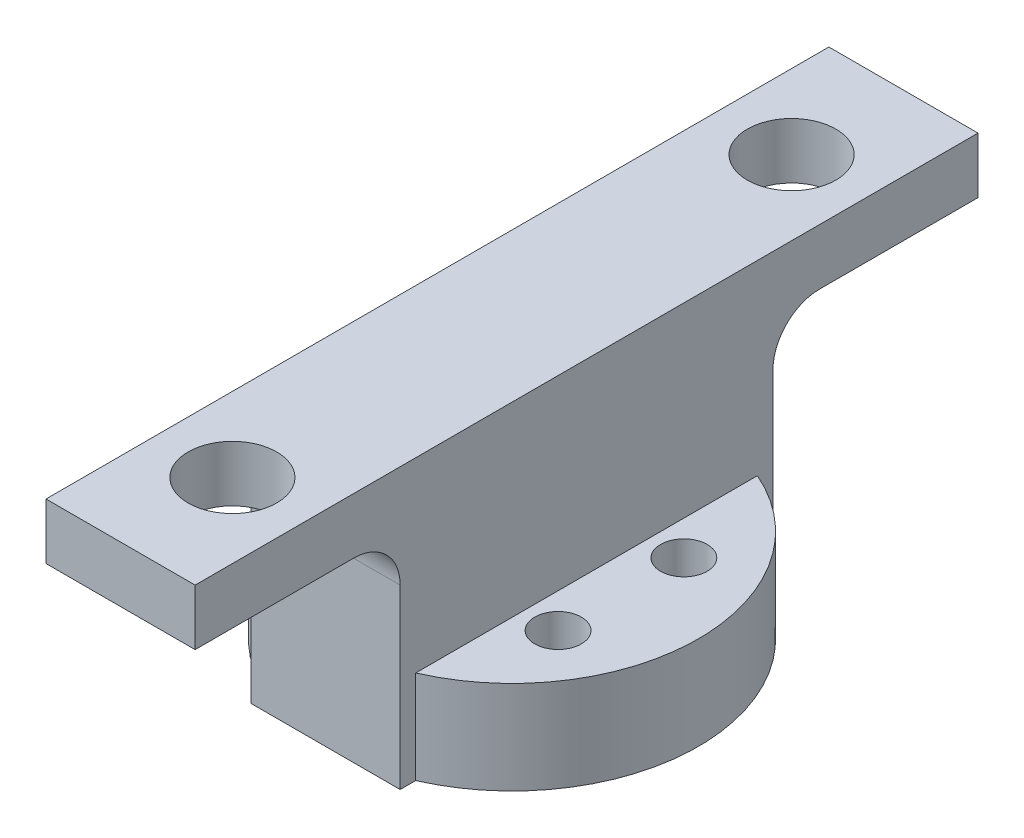
ISO-10303-21;
HEADER;
FILE_DESCRIPTION(('STEP AP214'),'2;1');
FILE_NAME('part.step','',(''),(''),'','','');
FILE_SCHEMA(('AUTOMOTIVE_DESIGN { 1 0 10303 214 1 1 1 1 }'));
ENDSEC;
DATA;
#1=APPLICATION_CONTEXT('core data for automotive mechanical design processes');
#2=APPLICATION_PROTOCOL_DEFINITION('international standard','automotive_design',2000,#1);
#3=PRODUCT_CONTEXT('',#1,'mechanical');
#4=PRODUCT('Part','Part','',(#3));
#5=PRODUCT_RELATED_PRODUCT_CATEGORY('part','',(#4));
#6=PRODUCT_DEFINITION_FORMATION('','',#4);
#7=PRODUCT_DEFINITION_CONTEXT('part definition',#1,'design');
#8=PRODUCT_DEFINITION('design','',#6,#7);
#9=PRODUCT_DEFINITION_SHAPE('','',#8);
#10=(LENGTH_UNIT() NAMED_UNIT(*) SI_UNIT(.MILLI.,.METRE.));
#11=(NAMED_UNIT(*) PLANE_ANGLE_UNIT() SI_UNIT($,.RADIAN.));
#12=(NAMED_UNIT(*) SI_UNIT($,.STERADIAN.) SOLID_ANGLE_UNIT());
#13=UNCERTAINTY_MEASURE_WITH_UNIT(LENGTH_MEASURE(1.E-05),#10,'distance_accuracy_value','');
#14=(GEOMETRIC_REPRESENTATION_CONTEXT(3) GLOBAL_UNCERTAINTY_ASSIGNED_CONTEXT((#13)) GLOBAL_UNIT_ASSIGNED_CONTEXT((#10,
#11,#12)) REPRESENTATION_CONTEXT('',''));
#15=CARTESIAN_POINT('',(0.,0.,0.));
#16=DIRECTION('',(0.,0.,1.));
#17=DIRECTION('',(1.,0.,0.));
#18=AXIS2_PLACEMENT_3D('',#15,#16,#17);
#19=CARTESIAN_POINT('',(0.,10.,0.));
#20=DIRECTION('',(0.,-1.,0.));
#21=DIRECTION('',(0.,0.,-1.));
#22=AXIS2_PLACEMENT_3D('',#19,#20,#21);
#23=CYLINDRICAL_SURFACE('',#22,20.);
#24=DIRECTION('',(0.,1.,0.));
#25=VECTOR('',#24,1.);
#26=CARTESIAN_POINT('',(-8.,-8.1723857475688,-18.3303027798234));
#27=LINE('',#26,#25);
#28=CARTESIAN_POINT('',(-8.,0.,-18.3303027798234));
#29=VERTEX_POINT('',#28);
#30=CARTESIAN_POINT('',(-8.,10.,-18.3303027798234));
#31=VERTEX_POINT('',#30);
#32=EDGE_CURVE('E184',#29,#31,#27,.T.);
#33=ORIENTED_EDGE('',*,*,#32,.F.);
#34=CARTESIAN_POINT('',(0.,0.,0.));
#35=DIRECTION('',(0.,1.,0.));
#36=DIRECTION('',(0.,0.,1.));
#37=AXIS2_PLACEMENT_3D('',#34,#35,#36);
#38=CIRCLE('',#37,20.);
#39=CARTESIAN_POINT('',(-8.,0.,18.3303027798234));
#40=VERTEX_POINT('',#39);
#41=EDGE_CURVE('E194',#29,#40,#38,.T.);
#42=ORIENTED_EDGE('',*,*,#41,.T.);
#43=DIRECTION('',(0.,1.,0.));
#44=VECTOR('',#43,1.);
#45=CARTESIAN_POINT('',(-8.,-8.1723857475688,18.3303027798234));
#46=LINE('',#45,#44);
#47=CARTESIAN_POINT('',(-8.,10.,18.3303027798234));
#48=VERTEX_POINT('',#47);
#49=EDGE_CURVE('E423',#40,#48,#46,.T.);
#50=ORIENTED_EDGE('',*,*,#49,.T.);
#51=CARTESIAN_POINT('',(0.,10.,0.));
#52=DIRECTION('',(0.,1.,0.));
#53=DIRECTION('',(0.,0.,1.));
#54=AXIS2_PLACEMENT_3D('',#51,#52,#53);
#55=CIRCLE('',#54,20.);
#56=EDGE_CURVE('E197',#31,#48,#55,.T.);
#57=ORIENTED_EDGE('',*,*,#56,.F.);
#58=EDGE_LOOP('',(#33,#42,#50,#57));
#59=FACE_BOUND('',#58,.T.);
#60=ADVANCED_FACE('F81',(#59),#23,.T.);
#61=DIRECTION('',(0.,1.,0.));
#62=VECTOR('',#61,1.);
#63=CARTESIAN_POINT('',(8.,-8.1723857475688,-18.3303027798234));
#64=LINE('',#63,#62);
#65=CARTESIAN_POINT('',(8.,0.,-18.3303027798234));
#66=VERTEX_POINT('',#65);
#67=CARTESIAN_POINT('',(8.,10.,-18.3303027798234));
#68=VERTEX_POINT('',#67);
#69=EDGE_CURVE('E198',#66,#68,#64,.T.);
#70=ORIENTED_EDGE('',*,*,#69,.T.);
#71=CARTESIAN_POINT('',(8.,10.,18.3303027798234));
#72=VERTEX_POINT('',#71);
#73=EDGE_CURVE('E301',#72,#68,#55,.T.);
#74=ORIENTED_EDGE('',*,*,#73,.F.);
#75=DIRECTION('',(0.,1.,0.));
#76=VECTOR('',#75,1.);
#77=CARTESIAN_POINT('',(8.,-8.1723857475688,18.3303027798234));
#78=LINE('',#77,#76);
#79=CARTESIAN_POINT('',(8.,0.,18.3303027798234));
#80=VERTEX_POINT('',#79);
#81=EDGE_CURVE('E425',#80,#72,#78,.T.);
#82=ORIENTED_EDGE('',*,*,#81,.F.);
#83=EDGE_CURVE('E206',#80,#66,#38,.T.);
#84=ORIENTED_EDGE('',*,*,#83,.T.);
#85=EDGE_LOOP('',(#70,#74,#82,#84));
#86=FACE_BOUND('',#85,.T.);
#87=ADVANCED_FACE('F356',(#86),#23,.T.);
#88=CARTESIAN_POINT('',(-8.,30.,20.));
#89=DIRECTION('',(0.,0.,-1.));
#90=DIRECTION('',(-1.,0.,0.));
#91=AXIS2_PLACEMENT_3D('',#88,#89,#90);
#92=PLANE('',#91);
#93=DIRECTION('',(0.,-1.,0.));
#94=VECTOR('',#93,1.);
#95=CARTESIAN_POINT('',(8.,30.,20.));
#96=LINE('',#95,#94);
#97=CARTESIAN_POINT('',(8.,19.,20.));
#98=VERTEX_POINT('',#97);
#99=CARTESIAN_POINT('',(8.,0.,20.));
#100=VERTEX_POINT('',#99);
#101=EDGE_CURVE('E296',#98,#100,#96,.T.);
#102=ORIENTED_EDGE('',*,*,#101,.F.);
#103=DIRECTION('',(-1.,0.,0.));
#104=VECTOR('',#103,1.);
#105=CARTESIAN_POINT('',(-8.,19.,20.));
#106=LINE('',#105,#104);
#107=CARTESIAN_POINT('',(-8.,19.,20.));
#108=VERTEX_POINT('',#107);
#109=EDGE_CURVE('E222',#98,#108,#106,.T.);
#110=ORIENTED_EDGE('',*,*,#109,.T.);
#111=DIRECTION('',(0.,-1.,0.));
#112=VECTOR('',#111,1.);
#113=CARTESIAN_POINT('',(-8.,30.,20.));
#114=LINE('',#113,#112);
#115=CARTESIAN_POINT('',(-8.,0.,20.));
#116=VERTEX_POINT('',#115);
#117=EDGE_CURVE('E241',#108,#116,#114,.T.);
#118=ORIENTED_EDGE('',*,*,#117,.T.);
#119=DIRECTION('',(1.,0.,0.));
#120=VECTOR('',#119,1.);
#121=CARTESIAN_POINT('',(0.,0.,20.));
#122=LINE('',#121,#120);
#123=EDGE_CURVE('E421',#116,#100,#122,.T.);
#124=ORIENTED_EDGE('',*,*,#123,.T.);
#125=EDGE_LOOP('',(#102,#110,#118,#124));
#126=FACE_BOUND('',#125,.T.);
#127=ADVANCED_FACE('F362',(#126),#92,.F.);
#128=CARTESIAN_POINT('',(0.,10.,0.));
#129=DIRECTION('',(0.,1.,0.));
#130=DIRECTION('',(0.,0.,1.));
#131=AXIS2_PLACEMENT_3D('',#128,#129,#130);
#132=PLANE('',#131);
#133=DIRECTION('',(0.,0.,-1.));
#134=VECTOR('',#133,1.);
#135=CARTESIAN_POINT('',(8.,10.,20.));
#136=LINE('',#135,#134);
#137=EDGE_CURVE('E220',#72,#68,#136,.T.);
#138=ORIENTED_EDGE('',*,*,#137,.F.);
#139=ORIENTED_EDGE('',*,*,#73,.T.);
#140=EDGE_LOOP('',(#138,#139));
#141=FACE_BOUND('',#140,.T.);
#142=CARTESIAN_POINT('',(11.69134295109,10.,-6.75));
#143=DIRECTION('',(0.,1.,0.));
#144=DIRECTION('',(0.,0.,1.));
#145=AXIS2_PLACEMENT_3D('',#142,#143,#144);
#146=CIRCLE('',#145,2.49999999999997);
#147=CARTESIAN_POINT('',(11.69134295109,10.,-4.25000000000003));
#148=VERTEX_POINT('',#147);
#149=EDGE_CURVE('E318',#148,#148,#146,.T.);
#150=ORIENTED_EDGE('',*,*,#149,.F.);
#151=EDGE_LOOP('',(#150));
#152=FACE_BOUND('',#151,.T.);
#153=CARTESIAN_POINT('',(11.6913429510899,10.,6.75));
#154=DIRECTION('',(0.,1.,0.));
#155=DIRECTION('',(0.,0.,1.));
#156=AXIS2_PLACEMENT_3D('',#153,#154,#155);
#157=CIRCLE('',#156,2.5);
#158=CARTESIAN_POINT('',(11.6913429510899,10.,9.25));
#159=VERTEX_POINT('',#158);
#160=EDGE_CURVE('E210',#159,#159,#157,.T.);
#161=ORIENTED_EDGE('',*,*,#160,.F.);
#162=EDGE_LOOP('',(#161));
#163=FACE_BOUND('',#162,.T.);
#164=ADVANCED_FACE('F352',(#141,#152,#163),#132,.T.);
#165=CARTESIAN_POINT('',(11.69134295109,10.,-6.75));
#166=DIRECTION('',(0.,-1.,0.));
#167=DIRECTION('',(0.,0.,-1.));
#168=AXIS2_PLACEMENT_3D('',#165,#166,#167);
#169=CYLINDRICAL_SURFACE('',#168,2.49999999999997);
#170=ORIENTED_EDGE('',*,*,#149,.T.);
#171=EDGE_LOOP('',(#170));
#172=FACE_BOUND('',#171,.T.);
#173=CARTESIAN_POINT('',(11.69134295109,0.,-6.75));
#174=DIRECTION('',(0.,1.,0.));
#175=DIRECTION('',(0.,0.,1.));
#176=AXIS2_PLACEMENT_3D('',#173,#174,#175);
#177=CIRCLE('',#176,2.49999999999997);
#178=CARTESIAN_POINT('',(11.69134295109,0.,-4.25000000000003));
#179=VERTEX_POINT('',#178);
#180=EDGE_CURVE('E207',#179,#179,#177,.T.);
#181=ORIENTED_EDGE('',*,*,#180,.F.);
#182=EDGE_LOOP('',(#181));
#183=FACE_BOUND('',#182,.T.);
#184=ADVANCED_FACE('F342',(#172,#183),#169,.F.);
#185=CARTESIAN_POINT('',(0.,10.,-13.5));
#186=DIRECTION('',(0.,-1.,0.));
#187=DIRECTION('',(0.,0.,-1.));
#188=AXIS2_PLACEMENT_3D('',#185,#186,#187);
#189=CYLINDRICAL_SURFACE('',#188,2.5);
#190=CARTESIAN_POINT('',(0.,10.,-13.5));
#191=DIRECTION('',(0.,1.,0.));
#192=DIRECTION('',(0.,0.,1.));
#193=AXIS2_PLACEMENT_3D('',#190,#191,#192);
#194=CIRCLE('',#193,2.5);
#195=CARTESIAN_POINT('',(0.,10.,-11.));
#196=VERTEX_POINT('',#195);
#197=EDGE_CURVE('E305',#196,#196,#194,.T.);
#198=ORIENTED_EDGE('',*,*,#197,.T.);
#199=EDGE_LOOP('',(#198));
#200=FACE_BOUND('',#199,.T.);
#201=CARTESIAN_POINT('',(0.,0.,-13.5));
#202=DIRECTION('',(0.,1.,0.));
#203=DIRECTION('',(0.,0.,1.));
#204=AXIS2_PLACEMENT_3D('',#201,#202,#203);
#205=CIRCLE('',#204,2.5);
#206=CARTESIAN_POINT('',(0.,0.,-11.));
#207=VERTEX_POINT('',#206);
#208=EDGE_CURVE('E212',#207,#207,#205,.T.);
#209=ORIENTED_EDGE('',*,*,#208,.F.);
#210=EDGE_LOOP('',(#209));
#211=FACE_BOUND('',#210,.T.);
#212=ADVANCED_FACE('F339',(#200,#211),#189,.F.);
#213=CARTESIAN_POINT('',(-11.6913429510898,10.,-6.75000000000014));
#214=DIRECTION('',(0.,-1.,0.));
#215=DIRECTION('',(0.,0.,-1.));
#216=AXIS2_PLACEMENT_3D('',#213,#214,#215);
#217=CYLINDRICAL_SURFACE('',#216,2.5);
#218=CARTESIAN_POINT('',(-11.6913429510898,10.,-6.75000000000014));
#219=DIRECTION('',(0.,1.,0.));
#220=DIRECTION('',(0.,0.,1.));
#221=AXIS2_PLACEMENT_3D('',#218,#219,#220);
#222=CIRCLE('',#221,2.5);
#223=CARTESIAN_POINT('',(-11.6913429510898,10.,-4.25000000000014));
#224=VERTEX_POINT('',#223);
#225=EDGE_CURVE('E315',#224,#224,#222,.T.);
#226=ORIENTED_EDGE('',*,*,#225,.T.);
#227=EDGE_LOOP('',(#226));
#228=FACE_BOUND('',#227,.T.);
#229=CARTESIAN_POINT('',(-11.6913429510898,0.,-6.75000000000014));
#230=DIRECTION('',(0.,1.,0.));
#231=DIRECTION('',(0.,0.,1.));
#232=AXIS2_PLACEMENT_3D('',#229,#230,#231);
#233=CIRCLE('',#232,2.5);
#234=CARTESIAN_POINT('',(-11.6913429510898,0.,-4.25000000000014));
#235=VERTEX_POINT('',#234);
#236=EDGE_CURVE('E332',#235,#235,#233,.T.);
#237=ORIENTED_EDGE('',*,*,#236,.F.);
#238=EDGE_LOOP('',(#237));
#239=FACE_BOUND('',#238,.T.);
#240=ADVANCED_FACE('F341',(#228,#239),#217,.F.);
#241=CARTESIAN_POINT('',(-11.69134295109,10.,6.74999999999989));
#242=DIRECTION('',(0.,-1.,0.));
#243=DIRECTION('',(0.,0.,-1.));
#244=AXIS2_PLACEMENT_3D('',#241,#242,#243);
#245=CYLINDRICAL_SURFACE('',#244,2.5);
#246=CARTESIAN_POINT('',(-11.69134295109,10.,6.74999999999989));
#247=DIRECTION('',(0.,1.,0.));
#248=DIRECTION('',(0.,0.,1.));
#249=AXIS2_PLACEMENT_3D('',#246,#247,#248);
#250=CIRCLE('',#249,2.5);
#251=CARTESIAN_POINT('',(-11.69134295109,10.,9.24999999999988));
#252=VERTEX_POINT('',#251);
#253=EDGE_CURVE('E308',#252,#252,#250,.T.);
#254=ORIENTED_EDGE('',*,*,#253,.T.);
#255=EDGE_LOOP('',(#254));
#256=FACE_BOUND('',#255,.T.);
#257=CARTESIAN_POINT('',(-11.69134295109,0.,6.74999999999989));
#258=DIRECTION('',(0.,1.,0.));
#259=DIRECTION('',(0.,0.,1.));
#260=AXIS2_PLACEMENT_3D('',#257,#258,#259);
#261=CIRCLE('',#260,2.5);
#262=CARTESIAN_POINT('',(-11.69134295109,0.,9.24999999999988));
#263=VERTEX_POINT('',#262);
#264=EDGE_CURVE('E329',#263,#263,#261,.T.);
#265=ORIENTED_EDGE('',*,*,#264,.F.);
#266=EDGE_LOOP('',(#265));
#267=FACE_BOUND('',#266,.T.);
#268=ADVANCED_FACE('F349',(#256,#267),#245,.F.);
#269=CARTESIAN_POINT('',(0.,10.,13.5));
#270=DIRECTION('',(0.,-1.,0.));
#271=DIRECTION('',(0.,0.,-1.));
#272=AXIS2_PLACEMENT_3D('',#269,#270,#271);
#273=CYLINDRICAL_SURFACE('',#272,2.5);
#274=CARTESIAN_POINT('',(0.,10.,13.5));
#275=DIRECTION('',(0.,1.,0.));
#276=DIRECTION('',(0.,0.,1.));
#277=AXIS2_PLACEMENT_3D('',#274,#275,#276);
#278=CIRCLE('',#277,2.5);
#279=CARTESIAN_POINT('',(0.,10.,16.));
#280=VERTEX_POINT('',#279);
#281=EDGE_CURVE('E309',#280,#280,#278,.T.);
#282=ORIENTED_EDGE('',*,*,#281,.T.);
#283=EDGE_LOOP('',(#282));
#284=FACE_BOUND('',#283,.T.);
#285=CARTESIAN_POINT('',(0.,0.,13.5));
#286=DIRECTION('',(0.,1.,0.));
#287=DIRECTION('',(0.,0.,1.));
#288=AXIS2_PLACEMENT_3D('',#285,#286,#287);
#289=CIRCLE('',#288,2.5);
#290=CARTESIAN_POINT('',(0.,0.,16.));
#291=VERTEX_POINT('',#290);
#292=EDGE_CURVE('E326',#291,#291,#289,.T.);
#293=ORIENTED_EDGE('',*,*,#292,.F.);
#294=EDGE_LOOP('',(#293));
#295=FACE_BOUND('',#294,.T.);
#296=ADVANCED_FACE('F453',(#284,#295),#273,.F.);
#297=CARTESIAN_POINT('',(11.6913429510899,10.,6.75));
#298=DIRECTION('',(0.,-1.,0.));
#299=DIRECTION('',(0.,0.,-1.));
#300=AXIS2_PLACEMENT_3D('',#297,#298,#299);
#301=CYLINDRICAL_SURFACE('',#300,2.5);
#302=ORIENTED_EDGE('',*,*,#160,.T.);
#303=EDGE_LOOP('',(#302));
#304=FACE_BOUND('',#303,.T.);
#305=CARTESIAN_POINT('',(11.6913429510899,0.,6.75));
#306=DIRECTION('',(0.,1.,0.));
#307=DIRECTION('',(0.,0.,1.));
#308=AXIS2_PLACEMENT_3D('',#305,#306,#307);
#309=CIRCLE('',#308,2.5);
#310=CARTESIAN_POINT('',(11.6913429510899,0.,9.25));
#311=VERTEX_POINT('',#310);
#312=EDGE_CURVE('E312',#311,#311,#309,.T.);
#313=ORIENTED_EDGE('',*,*,#312,.F.);
#314=EDGE_LOOP('',(#313));
#315=FACE_BOUND('',#314,.T.);
#316=ADVANCED_FACE('F372',(#304,#315),#301,.F.);
#317=DIRECTION('',(0.,0.,1.));
#318=VECTOR('',#317,1.);
#319=CARTESIAN_POINT('',(-8.,10.,20.));
#320=LINE('',#319,#318);
#321=EDGE_CURVE('E299',#31,#48,#320,.T.);
#322=ORIENTED_EDGE('',*,*,#321,.F.);
#323=ORIENTED_EDGE('',*,*,#56,.T.);
#324=EDGE_LOOP('',(#322,#323));
#325=FACE_BOUND('',#324,.T.);
#326=ORIENTED_EDGE('',*,*,#253,.F.);
#327=EDGE_LOOP('',(#326));
#328=FACE_BOUND('',#327,.T.);
#329=ORIENTED_EDGE('',*,*,#225,.F.);
#330=EDGE_LOOP('',(#329));
#331=FACE_BOUND('',#330,.T.);
#332=ADVANCED_FACE('F368',(#325,#328,#331),#132,.T.);
#333=CARTESIAN_POINT('',(0.,0.,0.));
#334=DIRECTION('',(0.,1.,0.));
#335=DIRECTION('',(0.,0.,1.));
#336=AXIS2_PLACEMENT_3D('',#333,#334,#335);
#337=PLANE('',#336);
#338=ORIENTED_EDGE('',*,*,#312,.T.);
#339=EDGE_LOOP('',(#338));
#340=FACE_BOUND('',#339,.T.);
#341=ORIENTED_EDGE('',*,*,#292,.T.);
#342=EDGE_LOOP('',(#341));
#343=FACE_BOUND('',#342,.T.);
#344=ORIENTED_EDGE('',*,*,#264,.T.);
#345=EDGE_LOOP('',(#344));
#346=FACE_BOUND('',#345,.T.);
#347=ORIENTED_EDGE('',*,*,#236,.T.);
#348=EDGE_LOOP('',(#347));
#349=FACE_BOUND('',#348,.T.);
#350=ORIENTED_EDGE('',*,*,#208,.T.);
#351=EDGE_LOOP('',(#350));
#352=FACE_BOUND('',#351,.T.);
#353=ORIENTED_EDGE('',*,*,#180,.T.);
#354=EDGE_LOOP('',(#353));
#355=FACE_BOUND('',#354,.T.);
#356=ORIENTED_EDGE('',*,*,#83,.F.);
#357=DIRECTION('',(0.,0.,-1.));
#358=VECTOR('',#357,1.);
#359=CARTESIAN_POINT('',(8.,0.,0.));
#360=LINE('',#359,#358);
#361=EDGE_CURVE('E428',#100,#80,#360,.T.);
#362=ORIENTED_EDGE('',*,*,#361,.F.);
#363=ORIENTED_EDGE('',*,*,#123,.F.);
#364=DIRECTION('',(0.,0.,1.));
#365=VECTOR('',#364,1.);
#366=CARTESIAN_POINT('',(-8.,0.,0.));
#367=LINE('',#366,#365);
#368=EDGE_CURVE('E204',#40,#116,#367,.T.);
#369=ORIENTED_EDGE('',*,*,#368,.F.);
#370=ORIENTED_EDGE('',*,*,#41,.F.);
#371=DIRECTION('',(0.,0.,1.));
#372=VECTOR('',#371,1.);
#373=CARTESIAN_POINT('',(-8.,0.,0.));
#374=LINE('',#373,#372);
#375=CARTESIAN_POINT('',(-8.,0.,-20.));
#376=VERTEX_POINT('',#375);
#377=EDGE_CURVE('E180',#376,#29,#374,.T.);
#378=ORIENTED_EDGE('',*,*,#377,.F.);
#379=DIRECTION('',(-1.,0.,0.));
#380=VECTOR('',#379,1.);
#381=CARTESIAN_POINT('',(0.,0.,-20.));
#382=LINE('',#381,#380);
#383=CARTESIAN_POINT('',(8.,0.,-20.));
#384=VERTEX_POINT('',#383);
#385=EDGE_CURVE('E239',#384,#376,#382,.T.);
#386=ORIENTED_EDGE('',*,*,#385,.F.);
#387=DIRECTION('',(0.,0.,-1.));
#388=VECTOR('',#387,1.);
#389=CARTESIAN_POINT('',(8.,0.,0.));
#390=LINE('',#389,#388);
#391=EDGE_CURVE('E431',#66,#384,#390,.T.);
#392=ORIENTED_EDGE('',*,*,#391,.F.);
#393=EDGE_LOOP('',(#356,#362,#363,#369,#370,#378,#386,#392));
#394=FACE_BOUND('',#393,.T.);
#395=ADVANCED_FACE('F201',(#340,#343,#346,#349,#352,#355,#394),#337,.F.);
#396=CARTESIAN_POINT('',(0.,30.,0.));
#397=DIRECTION('',(0.,-1.,0.));
#398=DIRECTION('',(0.,0.,-1.));
#399=AXIS2_PLACEMENT_3D('',#396,#397,#398);
#400=PLANE('',#399);
#401=DIRECTION('',(0.,0.,-1.));
#402=VECTOR('',#401,1.);
#403=CARTESIAN_POINT('',(8.,30.,20.));
#404=LINE('',#403,#402);
#405=CARTESIAN_POINT('',(8.00000000000001,30.,42.));
#406=VERTEX_POINT('',#405);
#407=CARTESIAN_POINT('',(8.,30.,-42.));
#408=VERTEX_POINT('',#407);
#409=EDGE_CURVE('E290',#406,#408,#404,.T.);
#410=ORIENTED_EDGE('',*,*,#409,.T.);
#411=DIRECTION('',(-1.,0.,0.));
#412=VECTOR('',#411,1.);
#413=CARTESIAN_POINT('',(-8.00000000000001,30.,-42.));
#414=LINE('',#413,#412);
#415=CARTESIAN_POINT('',(-8.00000000000001,30.,-42.));
#416=VERTEX_POINT('',#415);
#417=EDGE_CURVE('E258',#408,#416,#414,.T.);
#418=ORIENTED_EDGE('',*,*,#417,.T.);
#419=DIRECTION('',(0.,0.,1.));
#420=VECTOR('',#419,1.);
#421=CARTESIAN_POINT('',(-8.,30.,20.));
#422=LINE('',#421,#420);
#423=CARTESIAN_POINT('',(-8.,30.,42.));
#424=VERTEX_POINT('',#423);
#425=EDGE_CURVE('E294',#416,#424,#422,.T.);
#426=ORIENTED_EDGE('',*,*,#425,.T.);
#427=DIRECTION('',(1.,0.,0.));
#428=VECTOR('',#427,1.);
#429=CARTESIAN_POINT('',(-8.,30.,42.));
#430=LINE('',#429,#428);
#431=EDGE_CURVE('E274',#424,#406,#430,.T.);
#432=ORIENTED_EDGE('',*,*,#431,.T.);
#433=EDGE_LOOP('',(#410,#418,#426,#432));
#434=FACE_BOUND('',#433,.T.);
#435=CARTESIAN_POINT('',(0.,30.,30.));
#436=DIRECTION('',(0.,1.,0.));
#437=DIRECTION('',(0.,0.,1.));
#438=AXIS2_PLACEMENT_3D('',#435,#436,#437);
#439=CIRCLE('',#438,4.75);
#440=CARTESIAN_POINT('',(0.,30.,34.75));
#441=VERTEX_POINT('',#440);
#442=EDGE_CURVE('E267',#441,#441,#439,.T.);
#443=ORIENTED_EDGE('',*,*,#442,.F.);
#444=EDGE_LOOP('',(#443));
#445=FACE_BOUND('',#444,.T.);
#446=CARTESIAN_POINT('',(0.,30.,-30.));
#447=DIRECTION('',(0.,1.,0.));
#448=DIRECTION('',(0.,0.,1.));
#449=AXIS2_PLACEMENT_3D('',#446,#447,#448);
#450=CIRCLE('',#449,4.75);
#451=CARTESIAN_POINT('',(0.,30.,-25.25));
#452=VERTEX_POINT('',#451);
#453=EDGE_CURVE('E264',#452,#452,#450,.T.);
#454=ORIENTED_EDGE('',*,*,#453,.F.);
#455=EDGE_LOOP('',(#454));
#456=FACE_BOUND('',#455,.T.);
#457=ADVANCED_FACE('F367',(#434,#445,#456),#400,.F.);
#458=CARTESIAN_POINT('',(-8.,30.,20.));
#459=DIRECTION('',(1.,0.,0.));
#460=DIRECTION('',(0.,0.,-1.));
#461=AXIS2_PLACEMENT_3D('',#458,#459,#460);
#462=PLANE('',#461);
#463=DIRECTION('',(0.,-1.,0.));
#464=VECTOR('',#463,1.);
#465=CARTESIAN_POINT('',(-8.,30.,-20.));
#466=LINE('',#465,#464);
#467=CARTESIAN_POINT('',(-8.,19.,-20.));
#468=VERTEX_POINT('',#467);
#469=EDGE_CURVE('E187',#468,#376,#466,.T.);
#470=ORIENTED_EDGE('',*,*,#469,.T.);
#471=ORIENTED_EDGE('',*,*,#377,.T.);
#472=ORIENTED_EDGE('',*,*,#32,.T.);
#473=ORIENTED_EDGE('',*,*,#321,.T.);
#474=ORIENTED_EDGE('',*,*,#49,.F.);
#475=ORIENTED_EDGE('',*,*,#368,.T.);
#476=ORIENTED_EDGE('',*,*,#117,.F.);
#477=CARTESIAN_POINT('',(-8.,19.,25.));
#478=DIRECTION('',(1.,0.,0.));
#479=DIRECTION('',(0.,0.,-1.));
#480=AXIS2_PLACEMENT_3D('',#477,#478,#479);
#481=CIRCLE('',#480,5.);
#482=CARTESIAN_POINT('',(-8.,24.,25.));
#483=VERTEX_POINT('',#482);
#484=EDGE_CURVE('E89',#108,#483,#481,.T.);
#485=ORIENTED_EDGE('',*,*,#484,.T.);
#486=DIRECTION('',(0.,0.,1.));
#487=VECTOR('',#486,1.);
#488=CARTESIAN_POINT('',(-8.,24.,20.));
#489=LINE('',#488,#487);
#490=CARTESIAN_POINT('',(-8.,24.,42.));
#491=VERTEX_POINT('',#490);
#492=EDGE_CURVE('E277',#483,#491,#489,.T.);
#493=ORIENTED_EDGE('',*,*,#492,.T.);
#494=DIRECTION('',(0.,1.,0.));
#495=VECTOR('',#494,1.);
#496=CARTESIAN_POINT('',(-8.,24.,42.));
#497=LINE('',#496,#495);
#498=EDGE_CURVE('E284',#491,#424,#497,.T.);
#499=ORIENTED_EDGE('',*,*,#498,.T.);
#500=ORIENTED_EDGE('',*,*,#425,.F.);
#501=DIRECTION('',(0.,1.,0.));
#502=VECTOR('',#501,1.);
#503=CARTESIAN_POINT('',(-8.00000000000001,24.,-42.));
#504=LINE('',#503,#502);
#505=CARTESIAN_POINT('',(-8.00000000000001,24.,-42.));
#506=VERTEX_POINT('',#505);
#507=EDGE_CURVE('E418',#506,#416,#504,.T.);
#508=ORIENTED_EDGE('',*,*,#507,.F.);
#509=DIRECTION('',(0.,0.,1.));
#510=VECTOR('',#509,1.);
#511=CARTESIAN_POINT('',(-8.,24.,-20.));
#512=LINE('',#511,#510);
#513=CARTESIAN_POINT('',(-8.,24.,-25.));
#514=VERTEX_POINT('',#513);
#515=EDGE_CURVE('E232',#506,#514,#512,.T.);
#516=ORIENTED_EDGE('',*,*,#515,.T.);
#517=CARTESIAN_POINT('',(-8.,19.,-25.));
#518=DIRECTION('',(1.,0.,0.));
#519=DIRECTION('',(0.,0.,-1.));
#520=AXIS2_PLACEMENT_3D('',#517,#518,#519);
#521=CIRCLE('',#520,5.);
#522=EDGE_CURVE('E228',#514,#468,#521,.T.);
#523=ORIENTED_EDGE('',*,*,#522,.T.);
#524=EDGE_LOOP('',(#470,#471,#472,#473,#474,#475,#476,#485,#493,#499,#500,#508,#516,#523));
#525=FACE_BOUND('',#524,.T.);
#526=ADVANCED_FACE('F182',(#525),#462,.F.);
#527=CARTESIAN_POINT('',(-8.,30.,-20.));
#528=DIRECTION('',(0.,0.,1.));
#529=DIRECTION('',(1.,0.,0.));
#530=AXIS2_PLACEMENT_3D('',#527,#528,#529);
#531=PLANE('',#530);
#532=ORIENTED_EDGE('',*,*,#469,.F.);
#533=DIRECTION('',(1.,0.,0.));
#534=VECTOR('',#533,1.);
#535=CARTESIAN_POINT('',(-8.,19.,-20.));
#536=LINE('',#535,#534);
#537=CARTESIAN_POINT('',(8.,19.,-20.));
#538=VERTEX_POINT('',#537);
#539=EDGE_CURVE('E216',#468,#538,#536,.T.);
#540=ORIENTED_EDGE('',*,*,#539,.T.);
#541=DIRECTION('',(0.,-1.,0.));
#542=VECTOR('',#541,1.);
#543=CARTESIAN_POINT('',(8.,30.,-20.));
#544=LINE('',#543,#542);
#545=EDGE_CURVE('E240',#538,#384,#544,.T.);
#546=ORIENTED_EDGE('',*,*,#545,.T.);
#547=ORIENTED_EDGE('',*,*,#385,.T.);
#548=EDGE_LOOP('',(#532,#540,#546,#547));
#549=FACE_BOUND('',#548,.T.);
#550=ADVANCED_FACE('F237',(#549),#531,.F.);
#551=CARTESIAN_POINT('',(8.,30.,20.));
#552=DIRECTION('',(-1.,0.,0.));
#553=DIRECTION('',(0.,0.,1.));
#554=AXIS2_PLACEMENT_3D('',#551,#552,#553);
#555=PLANE('',#554);
#556=ORIENTED_EDGE('',*,*,#101,.T.);
#557=ORIENTED_EDGE('',*,*,#361,.T.);
#558=ORIENTED_EDGE('',*,*,#81,.T.);
#559=ORIENTED_EDGE('',*,*,#137,.T.);
#560=ORIENTED_EDGE('',*,*,#69,.F.);
#561=ORIENTED_EDGE('',*,*,#391,.T.);
#562=ORIENTED_EDGE('',*,*,#545,.F.);
#563=CARTESIAN_POINT('',(8.,19.,-25.));
#564=DIRECTION('',(-1.,0.,0.));
#565=DIRECTION('',(0.,0.,1.));
#566=AXIS2_PLACEMENT_3D('',#563,#564,#565);
#567=CIRCLE('',#566,5.);
#568=CARTESIAN_POINT('',(8.,24.,-25.));
#569=VERTEX_POINT('',#568);
#570=EDGE_CURVE('E226',#538,#569,#567,.T.);
#571=ORIENTED_EDGE('',*,*,#570,.T.);
#572=DIRECTION('',(0.,0.,-1.));
#573=VECTOR('',#572,1.);
#574=CARTESIAN_POINT('',(8.,24.,-20.));
#575=LINE('',#574,#573);
#576=CARTESIAN_POINT('',(8.,24.,-42.));
#577=VERTEX_POINT('',#576);
#578=EDGE_CURVE('E249',#569,#577,#575,.T.);
#579=ORIENTED_EDGE('',*,*,#578,.T.);
#580=DIRECTION('',(0.,1.,0.));
#581=VECTOR('',#580,1.);
#582=CARTESIAN_POINT('',(8.,24.,-42.));
#583=LINE('',#582,#581);
#584=EDGE_CURVE('E260',#577,#408,#583,.T.);
#585=ORIENTED_EDGE('',*,*,#584,.T.);
#586=ORIENTED_EDGE('',*,*,#409,.F.);
#587=DIRECTION('',(0.,1.,0.));
#588=VECTOR('',#587,1.);
#589=CARTESIAN_POINT('',(8.00000000000001,24.,42.));
#590=LINE('',#589,#588);
#591=CARTESIAN_POINT('',(8.00000000000001,24.,42.));
#592=VERTEX_POINT('',#591);
#593=EDGE_CURVE('E287',#592,#406,#590,.T.);
#594=ORIENTED_EDGE('',*,*,#593,.F.);
#595=DIRECTION('',(0.,0.,-1.));
#596=VECTOR('',#595,1.);
#597=CARTESIAN_POINT('',(8.,24.,20.));
#598=LINE('',#597,#596);
#599=CARTESIAN_POINT('',(8.,24.,25.));
#600=VERTEX_POINT('',#599);
#601=EDGE_CURVE('E282',#592,#600,#598,.T.);
#602=ORIENTED_EDGE('',*,*,#601,.T.);
#603=CARTESIAN_POINT('',(8.,19.,25.));
#604=DIRECTION('',(-1.,0.,0.));
#605=DIRECTION('',(0.,0.,1.));
#606=AXIS2_PLACEMENT_3D('',#603,#604,#605);
#607=CIRCLE('',#606,5.);
#608=EDGE_CURVE('E12',#600,#98,#607,.T.);
#609=ORIENTED_EDGE('',*,*,#608,.T.);
#610=EDGE_LOOP('',(#556,#557,#558,#559,#560,#561,#562,#571,#579,#585,#586,#594,#602,#609));
#611=FACE_BOUND('',#610,.T.);
#612=ADVANCED_FACE('F247',(#611),#555,.F.);
#613=CARTESIAN_POINT('',(0.,10.,0.));
#614=DIRECTION('',(0.,-1.,0.));
#615=DIRECTION('',(0.,0.,-1.));
#616=AXIS2_PLACEMENT_3D('',#613,#614,#615);
#617=PLANE('',#616);
#618=ORIENTED_EDGE('',*,*,#197,.F.);
#619=EDGE_LOOP('',(#618));
#620=FACE_BOUND('',#619,.T.);
#621=ADVANCED_FACE('F376',(#620),#617,.T.);
#622=ORIENTED_EDGE('',*,*,#281,.F.);
#623=EDGE_LOOP('',(#622));
#624=FACE_BOUND('',#623,.T.);
#625=ADVANCED_FACE('F384',(#624),#617,.T.);
#626=CARTESIAN_POINT('',(-8.,24.,42.));
#627=DIRECTION('',(0.,0.,1.));
#628=DIRECTION('',(1.,0.,0.));
#629=AXIS2_PLACEMENT_3D('',#626,#627,#628);
#630=PLANE('',#629);
#631=ORIENTED_EDGE('',*,*,#431,.F.);
#632=ORIENTED_EDGE('',*,*,#498,.F.);
#633=DIRECTION('',(1.,0.,0.));
#634=VECTOR('',#633,1.);
#635=CARTESIAN_POINT('',(-8.,24.,42.));
#636=LINE('',#635,#634);
#637=EDGE_CURVE('E279',#491,#592,#636,.T.);
#638=ORIENTED_EDGE('',*,*,#637,.T.);
#639=ORIENTED_EDGE('',*,*,#593,.T.);
#640=EDGE_LOOP('',(#631,#632,#638,#639));
#641=FACE_BOUND('',#640,.T.);
#642=ADVANCED_FACE('F387',(#641),#630,.T.);
#643=CARTESIAN_POINT('',(0.,24.,0.));
#644=DIRECTION('',(0.,1.,0.));
#645=DIRECTION('',(0.,0.,1.));
#646=AXIS2_PLACEMENT_3D('',#643,#644,#645);
#647=PLANE('',#646);
#648=CARTESIAN_POINT('',(0.,24.,30.));
#649=DIRECTION('',(0.,1.,0.));
#650=DIRECTION('',(0.,0.,1.));
#651=AXIS2_PLACEMENT_3D('',#648,#649,#650);
#652=CIRCLE('',#651,4.75);
#653=CARTESIAN_POINT('',(0.,24.,34.75));
#654=VERTEX_POINT('',#653);
#655=EDGE_CURVE('E271',#654,#654,#652,.T.);
#656=ORIENTED_EDGE('',*,*,#655,.T.);
#657=EDGE_LOOP('',(#656));
#658=FACE_BOUND('',#657,.T.);
#659=ORIENTED_EDGE('',*,*,#492,.F.);
#660=DIRECTION('',(-1.,0.,0.));
#661=VECTOR('',#660,1.);
#662=CARTESIAN_POINT('',(8.,24.,25.));
#663=LINE('',#662,#661);
#664=EDGE_CURVE('E96',#483,#600,#663,.F.);
#665=ORIENTED_EDGE('',*,*,#664,.T.);
#666=ORIENTED_EDGE('',*,*,#601,.F.);
#667=ORIENTED_EDGE('',*,*,#637,.F.);
#668=EDGE_LOOP('',(#659,#665,#666,#667));
#669=FACE_BOUND('',#668,.T.);
#670=ADVANCED_FACE('F394',(#658,#669),#647,.F.);
#671=CARTESIAN_POINT('',(0.,24.,30.));
#672=DIRECTION('',(0.,1.,0.));
#673=DIRECTION('',(0.,0.,1.));
#674=AXIS2_PLACEMENT_3D('',#671,#672,#673);
#675=CYLINDRICAL_SURFACE('',#674,4.75);
#676=ORIENTED_EDGE('',*,*,#655,.F.);
#677=EDGE_LOOP('',(#676));
#678=FACE_BOUND('',#677,.T.);
#679=ORIENTED_EDGE('',*,*,#442,.T.);
#680=EDGE_LOOP('',(#679));
#681=FACE_BOUND('',#680,.T.);
#682=ADVANCED_FACE('F398',(#678,#681),#675,.F.);
#683=CARTESIAN_POINT('',(-8.00000000000001,24.,-42.));
#684=DIRECTION('',(0.,0.,-1.));
#685=DIRECTION('',(-1.,0.,0.));
#686=AXIS2_PLACEMENT_3D('',#683,#684,#685);
#687=PLANE('',#686);
#688=ORIENTED_EDGE('',*,*,#417,.F.);
#689=ORIENTED_EDGE('',*,*,#584,.F.);
#690=DIRECTION('',(-1.,0.,0.));
#691=VECTOR('',#690,1.);
#692=CARTESIAN_POINT('',(-8.00000000000001,24.,-42.));
#693=LINE('',#692,#691);
#694=EDGE_CURVE('E256',#577,#506,#693,.T.);
#695=ORIENTED_EDGE('',*,*,#694,.T.);
#696=ORIENTED_EDGE('',*,*,#507,.T.);
#697=EDGE_LOOP('',(#688,#689,#695,#696));
#698=FACE_BOUND('',#697,.T.);
#699=ADVANCED_FACE('F402',(#698),#687,.T.);
#700=CARTESIAN_POINT('',(0.,24.,0.));
#701=DIRECTION('',(0.,-1.,0.));
#702=DIRECTION('',(0.,0.,-1.));
#703=AXIS2_PLACEMENT_3D('',#700,#701,#702);
#704=PLANE('',#703);
#705=CARTESIAN_POINT('',(0.,24.,-30.));
#706=DIRECTION('',(0.,1.,0.));
#707=DIRECTION('',(0.,0.,1.));
#708=AXIS2_PLACEMENT_3D('',#705,#706,#707);
#709=CIRCLE('',#708,4.75);
#710=CARTESIAN_POINT('',(0.,24.,-25.25));
#711=VERTEX_POINT('',#710);
#712=EDGE_CURVE('E268',#711,#711,#709,.T.);
#713=ORIENTED_EDGE('',*,*,#712,.T.);
#714=EDGE_LOOP('',(#713));
#715=FACE_BOUND('',#714,.T.);
#716=ORIENTED_EDGE('',*,*,#578,.F.);
#717=DIRECTION('',(1.,0.,0.));
#718=VECTOR('',#717,1.);
#719=CARTESIAN_POINT('',(0.,24.,-25.));
#720=LINE('',#719,#718);
#721=EDGE_CURVE('E219',#569,#514,#720,.F.);
#722=ORIENTED_EDGE('',*,*,#721,.T.);
#723=ORIENTED_EDGE('',*,*,#515,.F.);
#724=ORIENTED_EDGE('',*,*,#694,.F.);
#725=EDGE_LOOP('',(#716,#722,#723,#724));
#726=FACE_BOUND('',#725,.T.);
#727=ADVANCED_FACE('F254',(#715,#726),#704,.T.);
#728=CARTESIAN_POINT('',(0.,24.,-30.));
#729=DIRECTION('',(0.,1.,0.));
#730=DIRECTION('',(0.,0.,1.));
#731=AXIS2_PLACEMENT_3D('',#728,#729,#730);
#732=CYLINDRICAL_SURFACE('',#731,4.75);
#733=ORIENTED_EDGE('',*,*,#712,.F.);
#734=EDGE_LOOP('',(#733));
#735=FACE_BOUND('',#734,.T.);
#736=ORIENTED_EDGE('',*,*,#453,.T.);
#737=EDGE_LOOP('',(#736));
#738=FACE_BOUND('',#737,.T.);
#739=ADVANCED_FACE('F404',(#735,#738),#732,.F.);
#740=CARTESIAN_POINT('',(-8.,19.,-25.));
#741=DIRECTION('',(1.,0.,0.));
#742=DIRECTION('',(0.,0.,-1.));
#743=AXIS2_PLACEMENT_3D('',#740,#741,#742);
#744=CYLINDRICAL_SURFACE('',#743,5.);
#745=ORIENTED_EDGE('',*,*,#522,.F.);
#746=ORIENTED_EDGE('',*,*,#721,.F.);
#747=ORIENTED_EDGE('',*,*,#570,.F.);
#748=ORIENTED_EDGE('',*,*,#539,.F.);
#749=EDGE_LOOP('',(#745,#746,#747,#748));
#750=FACE_BOUND('',#749,.T.);
#751=ADVANCED_FACE('F243',(#750),#744,.F.);
#752=CARTESIAN_POINT('',(-8.,19.,25.));
#753=DIRECTION('',(1.,0.,0.));
#754=DIRECTION('',(0.,0.,-1.));
#755=AXIS2_PLACEMENT_3D('',#752,#753,#754);
#756=CYLINDRICAL_SURFACE('',#755,5.);
#757=ORIENTED_EDGE('',*,*,#608,.F.);
#758=ORIENTED_EDGE('',*,*,#664,.F.);
#759=ORIENTED_EDGE('',*,*,#484,.F.);
#760=ORIENTED_EDGE('',*,*,#109,.F.);
#761=EDGE_LOOP('',(#757,#758,#759,#760));
#762=FACE_BOUND('',#761,.T.);
#763=ADVANCED_FACE('F83',(#762),#756,.F.);
#764=CLOSED_SHELL('',(#60,#87,#127,#164,#184,#212,#240,#268,#296,#316,#332,#395,#457,#526,#550,
#612,#621,#625,#642,#670,#682,#699,#727,#739,#751,#763));
#765=MANIFOLD_SOLID_BREP('B2',#764);
#766=ADVANCED_BREP_SHAPE_REPRESENTATION('',(#18,#765),#14);
#767=SHAPE_DEFINITION_REPRESENTATION(#9,#766);
ENDSEC;
END-ISO-10303-21;
